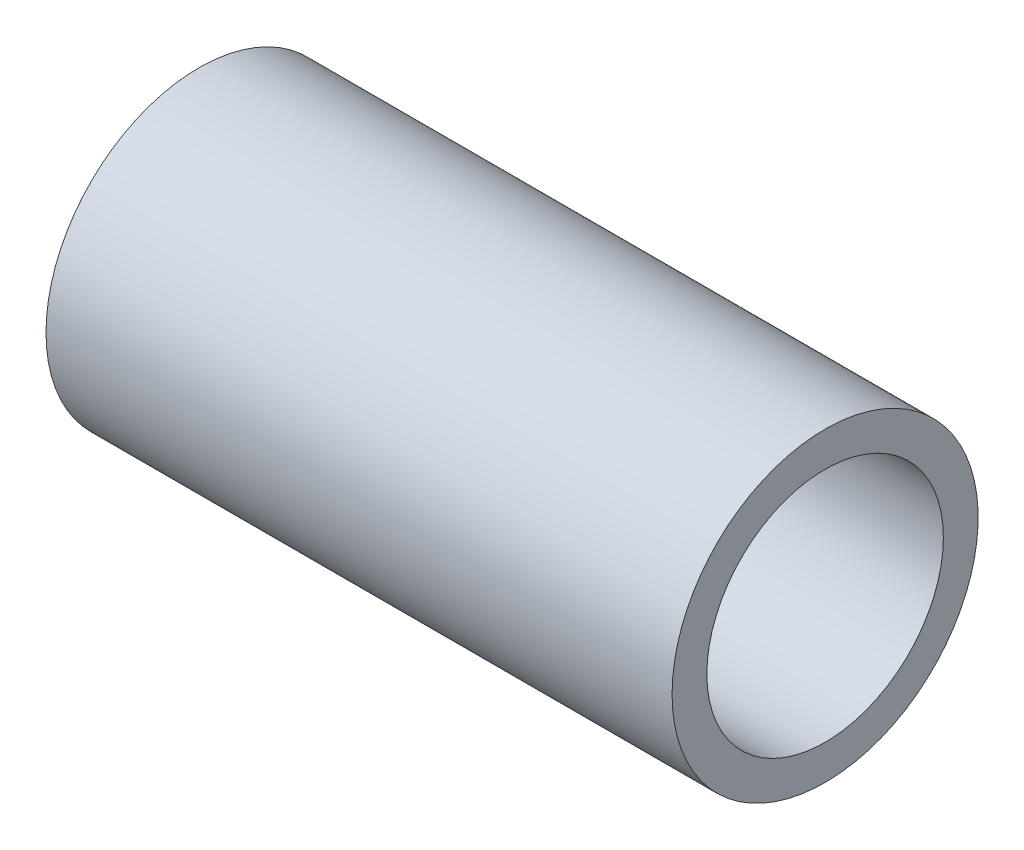
ISO-10303-21;
HEADER;
FILE_DESCRIPTION(('STEP AP214'),'2;1');
FILE_NAME('part.step','',(''),(''),'','','');
FILE_SCHEMA(('AUTOMOTIVE_DESIGN { 1 0 10303 214 1 1 1 1 }'));
ENDSEC;
DATA;
#1=APPLICATION_CONTEXT('core data for automotive mechanical design processes');
#2=APPLICATION_PROTOCOL_DEFINITION('international standard','automotive_design',2000,#1);
#3=PRODUCT_CONTEXT('',#1,'mechanical');
#4=PRODUCT('Part','Part','',(#3));
#5=PRODUCT_RELATED_PRODUCT_CATEGORY('part','',(#4));
#6=PRODUCT_DEFINITION_FORMATION('','',#4);
#7=PRODUCT_DEFINITION_CONTEXT('part definition',#1,'design');
#8=PRODUCT_DEFINITION('design','',#6,#7);
#9=PRODUCT_DEFINITION_SHAPE('','',#8);
#10=(LENGTH_UNIT() NAMED_UNIT(*) SI_UNIT(.MILLI.,.METRE.));
#11=(NAMED_UNIT(*) PLANE_ANGLE_UNIT() SI_UNIT($,.RADIAN.));
#12=(NAMED_UNIT(*) SI_UNIT($,.STERADIAN.) SOLID_ANGLE_UNIT());
#13=UNCERTAINTY_MEASURE_WITH_UNIT(LENGTH_MEASURE(1.E-05),#10,'distance_accuracy_value','');
#14=(GEOMETRIC_REPRESENTATION_CONTEXT(3) GLOBAL_UNCERTAINTY_ASSIGNED_CONTEXT((#13)) GLOBAL_UNIT_ASSIGNED_CONTEXT((#10,
#11,#12)) REPRESENTATION_CONTEXT('',''));
#15=CARTESIAN_POINT('',(0.,0.,0.));
#16=DIRECTION('',(0.,0.,1.));
#17=DIRECTION('',(1.,0.,0.));
#18=AXIS2_PLACEMENT_3D('',#15,#16,#17);
#19=CARTESIAN_POINT('',(45.,0.,0.));
#20=DIRECTION('',(1.,0.,0.));
#21=DIRECTION('',(0.,0.,-1.));
#22=AXIS2_PLACEMENT_3D('',#19,#20,#21);
#23=PLANE('',#22);
#24=CARTESIAN_POINT('',(45.,0.,0.));
#25=DIRECTION('',(1.,0.,0.));
#26=DIRECTION('',(0.,0.,-1.));
#27=AXIS2_PLACEMENT_3D('',#24,#25,#26);
#28=CIRCLE('',#27,11.);
#29=CARTESIAN_POINT('',(45.,0.,11.));
#30=VERTEX_POINT('',#29);
#31=EDGE_CURVE('E12',#30,#30,#28,.T.);
#32=ORIENTED_EDGE('',*,*,#31,.T.);
#33=EDGE_LOOP('',(#32));
#34=FACE_BOUND('',#33,.T.);
#35=CARTESIAN_POINT('',(45.,0.,0.));
#36=DIRECTION('',(1.,0.,0.));
#37=DIRECTION('',(0.,0.,-1.));
#38=AXIS2_PLACEMENT_3D('',#35,#36,#37);
#39=CIRCLE('',#38,8.5);
#40=CARTESIAN_POINT('',(45.,0.,8.5));
#41=VERTEX_POINT('',#40);
#42=EDGE_CURVE('E51',#41,#41,#39,.T.);
#43=ORIENTED_EDGE('',*,*,#42,.F.);
#44=EDGE_LOOP('',(#43));
#45=FACE_BOUND('',#44,.T.);
#46=ADVANCED_FACE('F40',(#34,#45),#23,.T.);
#47=CARTESIAN_POINT('',(0.,0.,0.));
#48=DIRECTION('',(1.,0.,0.));
#49=DIRECTION('',(0.,0.,-1.));
#50=AXIS2_PLACEMENT_3D('',#47,#48,#49);
#51=PLANE('',#50);
#52=CARTESIAN_POINT('',(0.,0.,0.));
#53=DIRECTION('',(1.,0.,0.));
#54=DIRECTION('',(0.,0.,-1.));
#55=AXIS2_PLACEMENT_3D('',#52,#53,#54);
#56=CIRCLE('',#55,11.);
#57=CARTESIAN_POINT('',(0.,0.,11.));
#58=VERTEX_POINT('',#57);
#59=EDGE_CURVE('E44',#58,#58,#56,.T.);
#60=ORIENTED_EDGE('',*,*,#59,.F.);
#61=EDGE_LOOP('',(#60));
#62=FACE_BOUND('',#61,.T.);
#63=CARTESIAN_POINT('',(0.,0.,0.));
#64=DIRECTION('',(1.,0.,0.));
#65=DIRECTION('',(0.,0.,-1.));
#66=AXIS2_PLACEMENT_3D('',#63,#64,#65);
#67=CIRCLE('',#66,8.5);
#68=CARTESIAN_POINT('',(0.,0.,8.5));
#69=VERTEX_POINT('',#68);
#70=EDGE_CURVE('E53',#69,#69,#67,.T.);
#71=ORIENTED_EDGE('',*,*,#70,.T.);
#72=EDGE_LOOP('',(#71));
#73=FACE_BOUND('',#72,.T.);
#74=ADVANCED_FACE('F63',(#62,#73),#51,.F.);
#75=CARTESIAN_POINT('',(45.,0.,0.));
#76=DIRECTION('',(-1.,0.,0.));
#77=DIRECTION('',(0.,0.,1.));
#78=AXIS2_PLACEMENT_3D('',#75,#76,#77);
#79=CYLINDRICAL_SURFACE('',#78,11.);
#80=CARTESIAN_POINT('',(45.,0.,11.));
#81=CARTESIAN_POINT('',(44.53125,0.,11.));
#82=CARTESIAN_POINT('',(44.0625,0.,11.));
#83=CARTESIAN_POINT('',(43.125,0.,11.));
#84=CARTESIAN_POINT('',(42.65625,0.,11.));
#85=CARTESIAN_POINT('',(41.71875,0.,11.));
#86=CARTESIAN_POINT('',(41.25,0.,11.));
#87=CARTESIAN_POINT('',(40.3125,0.,11.));
#88=CARTESIAN_POINT('',(39.84375,0.,11.));
#89=CARTESIAN_POINT('',(38.90625,0.,11.));
#90=CARTESIAN_POINT('',(38.4375,0.,11.));
#91=CARTESIAN_POINT('',(37.5,0.,11.));
#92=CARTESIAN_POINT('',(37.03125,0.,11.));
#93=CARTESIAN_POINT('',(36.09375,0.,11.));
#94=CARTESIAN_POINT('',(35.625,0.,11.));
#95=CARTESIAN_POINT('',(34.6875,0.,11.));
#96=CARTESIAN_POINT('',(34.21875,0.,11.));
#97=CARTESIAN_POINT('',(33.28125,0.,11.));
#98=CARTESIAN_POINT('',(32.8125,0.,11.));
#99=CARTESIAN_POINT('',(31.875,0.,11.));
#100=CARTESIAN_POINT('',(31.40625,0.,11.));
#101=CARTESIAN_POINT('',(30.46875,0.,11.));
#102=CARTESIAN_POINT('',(30.,0.,11.));
#103=CARTESIAN_POINT('',(29.0625,0.,11.));
#104=CARTESIAN_POINT('',(28.59375,0.,11.));
#105=CARTESIAN_POINT('',(27.65625,0.,11.));
#106=CARTESIAN_POINT('',(27.1875,0.,11.));
#107=CARTESIAN_POINT('',(26.25,0.,11.));
#108=CARTESIAN_POINT('',(25.78125,0.,11.));
#109=CARTESIAN_POINT('',(24.84375,0.,11.));
#110=CARTESIAN_POINT('',(24.375,0.,11.));
#111=CARTESIAN_POINT('',(23.4375,0.,11.));
#112=CARTESIAN_POINT('',(22.96875,0.,11.));
#113=CARTESIAN_POINT('',(22.03125,0.,11.));
#114=CARTESIAN_POINT('',(21.5625,0.,11.));
#115=CARTESIAN_POINT('',(20.625,0.,11.));
#116=CARTESIAN_POINT('',(20.15625,0.,11.));
#117=CARTESIAN_POINT('',(19.21875,0.,11.));
#118=CARTESIAN_POINT('',(18.75,0.,11.));
#119=CARTESIAN_POINT('',(17.8125,0.,11.));
#120=CARTESIAN_POINT('',(17.34375,0.,11.));
#121=CARTESIAN_POINT('',(16.40625,0.,11.));
#122=CARTESIAN_POINT('',(15.9375,0.,11.));
#123=CARTESIAN_POINT('',(15.,0.,11.));
#124=CARTESIAN_POINT('',(14.53125,0.,11.));
#125=CARTESIAN_POINT('',(13.59375,0.,11.));
#126=CARTESIAN_POINT('',(13.125,0.,11.));
#127=CARTESIAN_POINT('',(12.1875,0.,11.));
#128=CARTESIAN_POINT('',(11.71875,0.,11.));
#129=CARTESIAN_POINT('',(10.78125,0.,11.));
#130=CARTESIAN_POINT('',(10.3125,0.,11.));
#131=CARTESIAN_POINT('',(9.375,0.,11.));
#132=CARTESIAN_POINT('',(8.90625,0.,11.));
#133=CARTESIAN_POINT('',(7.96874999999999,0.,11.));
#134=CARTESIAN_POINT('',(7.5,0.,11.));
#135=CARTESIAN_POINT('',(6.5625,0.,11.));
#136=CARTESIAN_POINT('',(6.09375,0.,11.));
#137=CARTESIAN_POINT('',(5.15625,0.,11.));
#138=CARTESIAN_POINT('',(4.68749999999999,0.,11.));
#139=CARTESIAN_POINT('',(3.74999999999999,0.,11.));
#140=CARTESIAN_POINT('',(3.28124999999999,0.,11.));
#141=CARTESIAN_POINT('',(2.34374999999999,0.,11.));
#142=CARTESIAN_POINT('',(1.87499999999999,0.,11.));
#143=CARTESIAN_POINT('',(0.937499999999992,0.,11.));
#144=CARTESIAN_POINT('',(0.468749999999993,0.,11.));
#145=CARTESIAN_POINT('',(0.,0.,11.));
#146=B_SPLINE_CURVE_WITH_KNOTS('',3,(#80,#81,#82,#83,#84,#85,#86,#87,#88,#89,#90,#91,#92,#93,
#94,#95,#96,#97,#98,#99,#100,#101,#102,#103,#104,#105,#106,#107,#108,#109,#110,#111,#112,#113,
#114,#115,#116,#117,#118,#119,#120,#121,#122,#123,#124,#125,#126,#127,#128,#129,#130,#131,#132,
#133,#134,#135,#136,#137,#138,#139,#140,#141,#142,#143,#144,#145),.UNSPECIFIED.,.F.,.F.,(4,2,2,
2,2,2,2,2,2,2,2,2,2,2,2,2,2,2,2,2,2,2,2,2,2,2,2,2,2,2,2,2,4),(0.,1.40625,2.8125,
4.21875000000001,5.62500000000001,7.03125,8.4375,9.84375000000001,11.25,12.65625,14.0625,
15.46875,16.875,18.28125,19.6875,21.09375,22.5,23.90625,25.3125,26.71875,28.125,29.53125,
30.9375,32.34375,33.75,35.15625,36.5625,37.96875,39.375,40.78125,42.1875,43.59375,45.),.UNSPECIFIED.);
#147=EDGE_CURVE('BSEAM42',#30,#58,#146,.T.);
#148=ORIENTED_EDGE('',*,*,#31,.F.);
#149=ORIENTED_EDGE('',*,*,#59,.T.);
#150=ORIENTED_EDGE('',*,*,#147,.T.);
#151=ORIENTED_EDGE('',*,*,#147,.F.);
#152=EDGE_LOOP('',(#148,#150,#149,#151));
#153=FACE_BOUND('',#152,.T.);
#154=ADVANCED_FACE('F42',(#153),#79,.T.);
#155=CARTESIAN_POINT('',(45.,0.,0.));
#156=DIRECTION('',(-1.,0.,0.));
#157=DIRECTION('',(0.,0.,1.));
#158=AXIS2_PLACEMENT_3D('',#155,#156,#157);
#159=CYLINDRICAL_SURFACE('',#158,8.5);
#160=CARTESIAN_POINT('',(45.,0.,8.5));
#161=CARTESIAN_POINT('',(44.53125,0.,8.5));
#162=CARTESIAN_POINT('',(44.0625,0.,8.5));
#163=CARTESIAN_POINT('',(43.125,0.,8.5));
#164=CARTESIAN_POINT('',(42.65625,0.,8.5));
#165=CARTESIAN_POINT('',(41.71875,0.,8.5));
#166=CARTESIAN_POINT('',(41.25,0.,8.5));
#167=CARTESIAN_POINT('',(40.3125,0.,8.5));
#168=CARTESIAN_POINT('',(39.84375,0.,8.5));
#169=CARTESIAN_POINT('',(38.90625,0.,8.5));
#170=CARTESIAN_POINT('',(38.4375,0.,8.5));
#171=CARTESIAN_POINT('',(37.5,0.,8.5));
#172=CARTESIAN_POINT('',(37.03125,0.,8.5));
#173=CARTESIAN_POINT('',(36.09375,0.,8.5));
#174=CARTESIAN_POINT('',(35.625,0.,8.5));
#175=CARTESIAN_POINT('',(34.6875,0.,8.5));
#176=CARTESIAN_POINT('',(34.21875,0.,8.5));
#177=CARTESIAN_POINT('',(33.28125,0.,8.5));
#178=CARTESIAN_POINT('',(32.8125,0.,8.5));
#179=CARTESIAN_POINT('',(31.875,0.,8.5));
#180=CARTESIAN_POINT('',(31.40625,0.,8.5));
#181=CARTESIAN_POINT('',(30.46875,0.,8.5));
#182=CARTESIAN_POINT('',(30.,0.,8.5));
#183=CARTESIAN_POINT('',(29.0625,0.,8.5));
#184=CARTESIAN_POINT('',(28.59375,0.,8.5));
#185=CARTESIAN_POINT('',(27.65625,0.,8.5));
#186=CARTESIAN_POINT('',(27.1875,0.,8.5));
#187=CARTESIAN_POINT('',(26.25,0.,8.5));
#188=CARTESIAN_POINT('',(25.78125,0.,8.5));
#189=CARTESIAN_POINT('',(24.84375,0.,8.5));
#190=CARTESIAN_POINT('',(24.375,0.,8.5));
#191=CARTESIAN_POINT('',(23.4375,0.,8.5));
#192=CARTESIAN_POINT('',(22.96875,0.,8.5));
#193=CARTESIAN_POINT('',(22.03125,0.,8.5));
#194=CARTESIAN_POINT('',(21.5625,0.,8.5));
#195=CARTESIAN_POINT('',(20.625,0.,8.5));
#196=CARTESIAN_POINT('',(20.15625,0.,8.5));
#197=CARTESIAN_POINT('',(19.21875,0.,8.5));
#198=CARTESIAN_POINT('',(18.75,0.,8.5));
#199=CARTESIAN_POINT('',(17.8125,0.,8.5));
#200=CARTESIAN_POINT('',(17.34375,0.,8.5));
#201=CARTESIAN_POINT('',(16.40625,0.,8.5));
#202=CARTESIAN_POINT('',(15.9375,0.,8.5));
#203=CARTESIAN_POINT('',(15.,0.,8.5));
#204=CARTESIAN_POINT('',(14.53125,0.,8.5));
#205=CARTESIAN_POINT('',(13.59375,0.,8.5));
#206=CARTESIAN_POINT('',(13.125,0.,8.5));
#207=CARTESIAN_POINT('',(12.1875,0.,8.5));
#208=CARTESIAN_POINT('',(11.71875,0.,8.5));
#209=CARTESIAN_POINT('',(10.78125,0.,8.5));
#210=CARTESIAN_POINT('',(10.3125,0.,8.5));
#211=CARTESIAN_POINT('',(9.375,0.,8.5));
#212=CARTESIAN_POINT('',(8.90625,0.,8.5));
#213=CARTESIAN_POINT('',(7.96874999999999,0.,8.5));
#214=CARTESIAN_POINT('',(7.5,0.,8.5));
#215=CARTESIAN_POINT('',(6.5625,0.,8.5));
#216=CARTESIAN_POINT('',(6.09375,0.,8.5));
#217=CARTESIAN_POINT('',(5.15625,0.,8.5));
#218=CARTESIAN_POINT('',(4.68749999999999,0.,8.5));
#219=CARTESIAN_POINT('',(3.74999999999999,0.,8.5));
#220=CARTESIAN_POINT('',(3.28124999999999,0.,8.5));
#221=CARTESIAN_POINT('',(2.34374999999999,0.,8.5));
#222=CARTESIAN_POINT('',(1.87499999999999,0.,8.5));
#223=CARTESIAN_POINT('',(0.937499999999992,0.,8.5));
#224=CARTESIAN_POINT('',(0.468749999999993,0.,8.5));
#225=CARTESIAN_POINT('',(0.,0.,8.5));
#226=B_SPLINE_CURVE_WITH_KNOTS('',3,(#160,#161,#162,#163,#164,#165,#166,#167,#168,#169,#170,
#171,#172,#173,#174,#175,#176,#177,#178,#179,#180,#181,#182,#183,#184,#185,#186,#187,#188,#189,
#190,#191,#192,#193,#194,#195,#196,#197,#198,#199,#200,#201,#202,#203,#204,#205,#206,#207,#208,
#209,#210,#211,#212,#213,#214,#215,#216,#217,#218,#219,#220,#221,#222,#223,#224,#225),
.UNSPECIFIED.,.F.,.F.,(4,2,2,2,2,2,2,2,2,2,2,2,2,2,2,2,2,2,2,2,2,2,2,2,2,2,2,2,2,2,2,2,4),(0.,
1.40625,2.8125,4.21875000000001,5.62500000000001,7.03125,8.4375,9.84375000000001,11.25,12.65625,
14.0625,15.46875,16.875,18.28125,19.6875,21.09375,22.5,23.90625,25.3125,26.71875,28.125,
29.53125,30.9375,32.34375,33.75,35.15625,36.5625,37.96875,39.375,40.78125,42.1875,43.59375,45.),.UNSPECIFIED.);
#227=EDGE_CURVE('BSEAM59',#41,#69,#226,.T.);
#228=ORIENTED_EDGE('',*,*,#42,.T.);
#229=ORIENTED_EDGE('',*,*,#70,.F.);
#230=ORIENTED_EDGE('',*,*,#227,.T.);
#231=ORIENTED_EDGE('',*,*,#227,.F.);
#232=EDGE_LOOP('',(#228,#230,#229,#231));
#233=FACE_BOUND('',#232,.T.);
#234=ADVANCED_FACE('F59',(#233),#159,.F.);
#235=CLOSED_SHELL('',(#46,#74,#154,#234));
#236=MANIFOLD_SOLID_BREP('B2',#235);
#237=ADVANCED_BREP_SHAPE_REPRESENTATION('',(#18,#236),#14);
#238=SHAPE_DEFINITION_REPRESENTATION(#9,#237);
ENDSEC;
END-ISO-10303-21;
